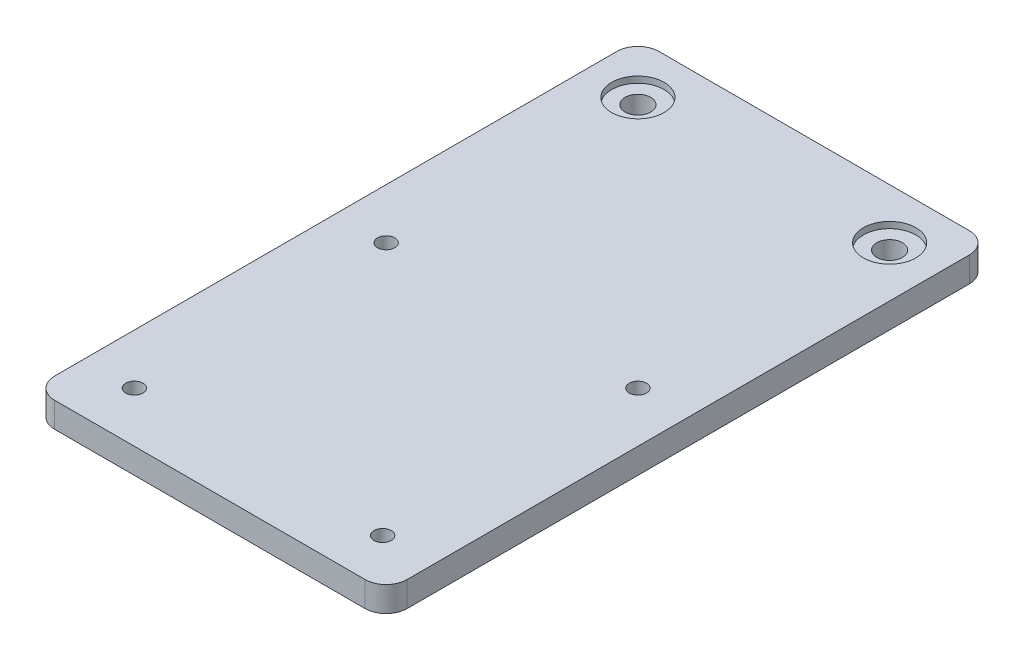
ISO-10303-21;
HEADER;
FILE_DESCRIPTION(('STEP AP214'),'2;1');
FILE_NAME('part.step','',(''),(''),'','','');
FILE_SCHEMA(('AUTOMOTIVE_DESIGN { 1 0 10303 214 1 1 1 1 }'));
ENDSEC;
DATA;
#1=APPLICATION_CONTEXT('core data for automotive mechanical design processes');
#2=APPLICATION_PROTOCOL_DEFINITION('international standard','automotive_design',2000,#1);
#3=PRODUCT_CONTEXT('',#1,'mechanical');
#4=PRODUCT('Part','Part','',(#3));
#5=PRODUCT_RELATED_PRODUCT_CATEGORY('part','',(#4));
#6=PRODUCT_DEFINITION_FORMATION('','',#4);
#7=PRODUCT_DEFINITION_CONTEXT('part definition',#1,'design');
#8=PRODUCT_DEFINITION('design','',#6,#7);
#9=PRODUCT_DEFINITION_SHAPE('','',#8);
#10=(LENGTH_UNIT() NAMED_UNIT(*) SI_UNIT(.MILLI.,.METRE.));
#11=(NAMED_UNIT(*) PLANE_ANGLE_UNIT() SI_UNIT($,.RADIAN.));
#12=(NAMED_UNIT(*) SI_UNIT($,.STERADIAN.) SOLID_ANGLE_UNIT());
#13=UNCERTAINTY_MEASURE_WITH_UNIT(LENGTH_MEASURE(1.E-05),#10,'distance_accuracy_value','');
#14=(GEOMETRIC_REPRESENTATION_CONTEXT(3) GLOBAL_UNCERTAINTY_ASSIGNED_CONTEXT((#13)) GLOBAL_UNIT_ASSIGNED_CONTEXT((#10,
#11,#12)) REPRESENTATION_CONTEXT('',''));
#15=CARTESIAN_POINT('',(0.,0.,0.));
#16=DIRECTION('',(0.,0.,1.));
#17=DIRECTION('',(1.,0.,0.));
#18=AXIS2_PLACEMENT_3D('',#15,#16,#17);
#19=CARTESIAN_POINT('',(30.,6.,-60.));
#20=DIRECTION('',(0.,-1.,0.));
#21=DIRECTION('',(0.,0.,-1.));
#22=AXIS2_PLACEMENT_3D('',#19,#20,#21);
#23=CYLINDRICAL_SURFACE('',#22,3.05);
#24=CARTESIAN_POINT('',(30.,0.,-60.));
#25=DIRECTION('',(0.,-1.,0.));
#26=DIRECTION('',(0.,0.,-1.));
#27=AXIS2_PLACEMENT_3D('',#24,#25,#26);
#28=CIRCLE('',#27,3.05);
#29=CARTESIAN_POINT('',(30.,0.,-63.05));
#30=VERTEX_POINT('',#29);
#31=EDGE_CURVE('E177',#30,#30,#28,.T.);
#32=ORIENTED_EDGE('',*,*,#31,.T.);
#33=EDGE_LOOP('',(#32));
#34=FACE_BOUND('',#33,.T.);
#35=CARTESIAN_POINT('',(30.,4.5,-60.));
#36=DIRECTION('',(0.,1.,0.));
#37=DIRECTION('',(0.,0.,1.));
#38=AXIS2_PLACEMENT_3D('',#35,#36,#37);
#39=CIRCLE('',#38,3.05);
#40=CARTESIAN_POINT('',(30.,4.5,-56.95));
#41=VERTEX_POINT('',#40);
#42=EDGE_CURVE('E43',#41,#41,#39,.F.);
#43=ORIENTED_EDGE('',*,*,#42,.F.);
#44=EDGE_LOOP('',(#43));
#45=FACE_BOUND('',#44,.T.);
#46=ADVANCED_FACE('F39',(#34,#45),#23,.F.);
#47=CARTESIAN_POINT('',(-30.,6.,-60.));
#48=DIRECTION('',(0.,-1.,0.));
#49=DIRECTION('',(0.,0.,-1.));
#50=AXIS2_PLACEMENT_3D('',#47,#48,#49);
#51=CYLINDRICAL_SURFACE('',#50,3.05);
#52=CARTESIAN_POINT('',(-30.,0.,-60.));
#53=DIRECTION('',(0.,-1.,0.));
#54=DIRECTION('',(0.,0.,-1.));
#55=AXIS2_PLACEMENT_3D('',#52,#53,#54);
#56=CIRCLE('',#55,3.05);
#57=CARTESIAN_POINT('',(-30.,0.,-63.05));
#58=VERTEX_POINT('',#57);
#59=EDGE_CURVE('E223',#58,#58,#56,.T.);
#60=ORIENTED_EDGE('',*,*,#59,.T.);
#61=EDGE_LOOP('',(#60));
#62=FACE_BOUND('',#61,.T.);
#63=CARTESIAN_POINT('',(-30.,4.5,-60.));
#64=DIRECTION('',(0.,1.,0.));
#65=DIRECTION('',(0.,0.,1.));
#66=AXIS2_PLACEMENT_3D('',#63,#64,#65);
#67=CIRCLE('',#66,3.05);
#68=CARTESIAN_POINT('',(-30.,4.5,-56.95));
#69=VERTEX_POINT('',#68);
#70=EDGE_CURVE('E178',#69,#69,#67,.F.);
#71=ORIENTED_EDGE('',*,*,#70,.F.);
#72=EDGE_LOOP('',(#71));
#73=FACE_BOUND('',#72,.T.);
#74=ADVANCED_FACE('F272',(#62,#73),#51,.F.);
#75=CARTESIAN_POINT('',(-30.,6.,60.));
#76=DIRECTION('',(0.,-1.,0.));
#77=DIRECTION('',(0.,0.,-1.));
#78=AXIS2_PLACEMENT_3D('',#75,#76,#77);
#79=CYLINDRICAL_SURFACE('',#78,2.05);
#80=CARTESIAN_POINT('',(-30.,6.,60.));
#81=DIRECTION('',(0.,-1.,0.));
#82=DIRECTION('',(0.,0.,-1.));
#83=AXIS2_PLACEMENT_3D('',#80,#81,#82);
#84=CIRCLE('',#83,2.05);
#85=CARTESIAN_POINT('',(-30.,6.,57.95));
#86=VERTEX_POINT('',#85);
#87=EDGE_CURVE('E142',#86,#86,#84,.T.);
#88=ORIENTED_EDGE('',*,*,#87,.F.);
#89=EDGE_LOOP('',(#88));
#90=FACE_BOUND('',#89,.T.);
#91=CARTESIAN_POINT('',(-30.,1.3,60.));
#92=DIRECTION('',(0.,-1.,0.));
#93=DIRECTION('',(0.,0.,-1.));
#94=AXIS2_PLACEMENT_3D('',#91,#92,#93);
#95=CIRCLE('',#94,2.05);
#96=CARTESIAN_POINT('',(-30.,1.3,57.95));
#97=VERTEX_POINT('',#96);
#98=EDGE_CURVE('E175',#97,#97,#95,.F.);
#99=ORIENTED_EDGE('',*,*,#98,.F.);
#100=EDGE_LOOP('',(#99));
#101=FACE_BOUND('',#100,.T.);
#102=ADVANCED_FACE('F279',(#90,#101),#79,.F.);
#103=CARTESIAN_POINT('',(30.,6.,60.8346625899288));
#104=DIRECTION('',(0.,-1.,0.));
#105=DIRECTION('',(0.,0.,-1.));
#106=AXIS2_PLACEMENT_3D('',#103,#104,#105);
#107=CYLINDRICAL_SURFACE('',#106,2.05);
#108=CARTESIAN_POINT('',(30.,6.,60.8346625899288));
#109=DIRECTION('',(0.,-1.,0.));
#110=DIRECTION('',(0.,0.,-1.));
#111=AXIS2_PLACEMENT_3D('',#108,#109,#110);
#112=CIRCLE('',#111,2.05);
#113=CARTESIAN_POINT('',(30.,6.,58.7846625899288));
#114=VERTEX_POINT('',#113);
#115=EDGE_CURVE('E230',#114,#114,#112,.T.);
#116=ORIENTED_EDGE('',*,*,#115,.F.);
#117=EDGE_LOOP('',(#116));
#118=FACE_BOUND('',#117,.T.);
#119=CARTESIAN_POINT('',(30.,1.3,60.8346625899288));
#120=DIRECTION('',(0.,-1.,0.));
#121=DIRECTION('',(0.,0.,-1.));
#122=AXIS2_PLACEMENT_3D('',#119,#120,#121);
#123=CIRCLE('',#122,2.05);
#124=CARTESIAN_POINT('',(30.,1.3,58.7846625899288));
#125=VERTEX_POINT('',#124);
#126=EDGE_CURVE('E172',#125,#125,#123,.F.);
#127=ORIENTED_EDGE('',*,*,#126,.F.);
#128=EDGE_LOOP('',(#127));
#129=FACE_BOUND('',#128,.T.);
#130=ADVANCED_FACE('F292',(#118,#129),#107,.F.);
#131=CARTESIAN_POINT('',(-30.,6.,0.));
#132=DIRECTION('',(0.,-1.,0.));
#133=DIRECTION('',(0.,0.,-1.));
#134=AXIS2_PLACEMENT_3D('',#131,#132,#133);
#135=CYLINDRICAL_SURFACE('',#134,2.05);
#136=CARTESIAN_POINT('',(-30.,6.,0.));
#137=DIRECTION('',(0.,-1.,0.));
#138=DIRECTION('',(0.,0.,-1.));
#139=AXIS2_PLACEMENT_3D('',#136,#137,#138);
#140=CIRCLE('',#139,2.05);
#141=CARTESIAN_POINT('',(-30.,6.,-2.05000000000001));
#142=VERTEX_POINT('',#141);
#143=EDGE_CURVE('E227',#142,#142,#140,.T.);
#144=ORIENTED_EDGE('',*,*,#143,.F.);
#145=EDGE_LOOP('',(#144));
#146=FACE_BOUND('',#145,.T.);
#147=CARTESIAN_POINT('',(-30.,1.3,0.));
#148=DIRECTION('',(0.,-1.,0.));
#149=DIRECTION('',(0.,0.,-1.));
#150=AXIS2_PLACEMENT_3D('',#147,#148,#149);
#151=CIRCLE('',#150,2.05);
#152=CARTESIAN_POINT('',(-30.,1.3,-2.05000000000001));
#153=VERTEX_POINT('',#152);
#154=EDGE_CURVE('E168',#153,#153,#151,.F.);
#155=ORIENTED_EDGE('',*,*,#154,.F.);
#156=EDGE_LOOP('',(#155));
#157=FACE_BOUND('',#156,.T.);
#158=ADVANCED_FACE('F289',(#146,#157),#135,.F.);
#159=CARTESIAN_POINT('',(30.,6.,0.));
#160=DIRECTION('',(0.,-1.,0.));
#161=DIRECTION('',(0.,0.,-1.));
#162=AXIS2_PLACEMENT_3D('',#159,#160,#161);
#163=CYLINDRICAL_SURFACE('',#162,2.05);
#164=CARTESIAN_POINT('',(30.,6.,0.));
#165=DIRECTION('',(0.,-1.,0.));
#166=DIRECTION('',(0.,0.,-1.));
#167=AXIS2_PLACEMENT_3D('',#164,#165,#166);
#168=CIRCLE('',#167,2.05);
#169=CARTESIAN_POINT('',(30.,6.,-2.05000000000001));
#170=VERTEX_POINT('',#169);
#171=EDGE_CURVE('E224',#170,#170,#168,.T.);
#172=ORIENTED_EDGE('',*,*,#171,.F.);
#173=EDGE_LOOP('',(#172));
#174=FACE_BOUND('',#173,.T.);
#175=CARTESIAN_POINT('',(30.,1.3,0.));
#176=DIRECTION('',(0.,-1.,0.));
#177=DIRECTION('',(0.,0.,-1.));
#178=AXIS2_PLACEMENT_3D('',#175,#176,#177);
#179=CIRCLE('',#178,2.05);
#180=CARTESIAN_POINT('',(30.,1.3,-2.05000000000001));
#181=VERTEX_POINT('',#180);
#182=EDGE_CURVE('E165',#181,#181,#179,.F.);
#183=ORIENTED_EDGE('',*,*,#182,.F.);
#184=EDGE_LOOP('',(#183));
#185=FACE_BOUND('',#184,.T.);
#186=ADVANCED_FACE('F287',(#174,#185),#163,.F.);
#187=CARTESIAN_POINT('',(-37.,6.,67.));
#188=DIRECTION('',(0.,-1.,0.));
#189=DIRECTION('',(0.,0.,-1.));
#190=AXIS2_PLACEMENT_3D('',#187,#188,#189);
#191=CYLINDRICAL_SURFACE('',#190,4.99999999999999);
#192=CARTESIAN_POINT('',(-37.,0.,67.));
#193=DIRECTION('',(0.,1.,0.));
#194=DIRECTION('',(0.,0.,-1.));
#195=AXIS2_PLACEMENT_3D('',#192,#193,#194);
#196=CIRCLE('',#195,4.99999999999999);
#197=CARTESIAN_POINT('',(-42.,0.,67.));
#198=VERTEX_POINT('',#197);
#199=CARTESIAN_POINT('',(-37.,0.,72.));
#200=VERTEX_POINT('',#199);
#201=EDGE_CURVE('E138',#198,#200,#196,.T.);
#202=ORIENTED_EDGE('',*,*,#201,.T.);
#203=DIRECTION('',(0.,-1.,0.));
#204=VECTOR('',#203,1.);
#205=CARTESIAN_POINT('',(-37.,6.,72.));
#206=LINE('',#205,#204);
#207=CARTESIAN_POINT('',(-37.,6.,72.));
#208=VERTEX_POINT('',#207);
#209=EDGE_CURVE('E11',#208,#200,#206,.T.);
#210=ORIENTED_EDGE('',*,*,#209,.F.);
#211=CARTESIAN_POINT('',(-37.,6.,67.));
#212=DIRECTION('',(0.,1.,0.));
#213=DIRECTION('',(0.,0.,-1.));
#214=AXIS2_PLACEMENT_3D('',#211,#212,#213);
#215=CIRCLE('',#214,4.99999999999999);
#216=CARTESIAN_POINT('',(-42.,6.,67.));
#217=VERTEX_POINT('',#216);
#218=EDGE_CURVE('E153',#217,#208,#215,.T.);
#219=ORIENTED_EDGE('',*,*,#218,.F.);
#220=DIRECTION('',(0.,-1.,0.));
#221=VECTOR('',#220,1.);
#222=CARTESIAN_POINT('',(-42.,6.,67.));
#223=LINE('',#222,#221);
#224=EDGE_CURVE('E134',#217,#198,#223,.T.);
#225=ORIENTED_EDGE('',*,*,#224,.T.);
#226=EDGE_LOOP('',(#202,#210,#219,#225));
#227=FACE_BOUND('',#226,.T.);
#228=ADVANCED_FACE('F41',(#227),#191,.T.);
#229=CARTESIAN_POINT('',(37.,6.,72.));
#230=DIRECTION('',(0.,0.,-1.));
#231=DIRECTION('',(-1.,0.,0.));
#232=AXIS2_PLACEMENT_3D('',#229,#230,#231);
#233=PLANE('',#232);
#234=DIRECTION('',(1.,0.,0.));
#235=VECTOR('',#234,1.);
#236=CARTESIAN_POINT('',(37.,0.,72.));
#237=LINE('',#236,#235);
#238=CARTESIAN_POINT('',(37.,0.,72.));
#239=VERTEX_POINT('',#238);
#240=EDGE_CURVE('E141',#200,#239,#237,.T.);
#241=ORIENTED_EDGE('',*,*,#240,.T.);
#242=DIRECTION('',(0.,-1.,0.));
#243=VECTOR('',#242,1.);
#244=CARTESIAN_POINT('',(37.,6.,72.));
#245=LINE('',#244,#243);
#246=CARTESIAN_POINT('',(37.,6.,72.));
#247=VERTEX_POINT('',#246);
#248=EDGE_CURVE('E49',#247,#239,#245,.T.);
#249=ORIENTED_EDGE('',*,*,#248,.F.);
#250=DIRECTION('',(1.,0.,0.));
#251=VECTOR('',#250,1.);
#252=CARTESIAN_POINT('',(37.,6.,72.));
#253=LINE('',#252,#251);
#254=EDGE_CURVE('E101',#208,#247,#253,.T.);
#255=ORIENTED_EDGE('',*,*,#254,.F.);
#256=ORIENTED_EDGE('',*,*,#209,.T.);
#257=EDGE_LOOP('',(#241,#249,#255,#256));
#258=FACE_BOUND('',#257,.T.);
#259=ADVANCED_FACE('F531',(#258),#233,.F.);
#260=CARTESIAN_POINT('',(37.,6.,67.));
#261=DIRECTION('',(0.,-1.,0.));
#262=DIRECTION('',(0.,0.,-1.));
#263=AXIS2_PLACEMENT_3D('',#260,#261,#262);
#264=CYLINDRICAL_SURFACE('',#263,5.);
#265=CARTESIAN_POINT('',(37.,0.,67.));
#266=DIRECTION('',(0.,1.,0.));
#267=DIRECTION('',(0.,0.,1.));
#268=AXIS2_PLACEMENT_3D('',#265,#266,#267);
#269=CIRCLE('',#268,5.);
#270=CARTESIAN_POINT('',(42.,0.,67.));
#271=VERTEX_POINT('',#270);
#272=EDGE_CURVE('E144',#239,#271,#269,.T.);
#273=ORIENTED_EDGE('',*,*,#272,.T.);
#274=DIRECTION('',(0.,-1.,0.));
#275=VECTOR('',#274,1.);
#276=CARTESIAN_POINT('',(42.,6.,67.));
#277=LINE('',#276,#275);
#278=CARTESIAN_POINT('',(42.,6.,67.));
#279=VERTEX_POINT('',#278);
#280=EDGE_CURVE('E160',#279,#271,#277,.T.);
#281=ORIENTED_EDGE('',*,*,#280,.F.);
#282=CARTESIAN_POINT('',(37.,6.,67.));
#283=DIRECTION('',(0.,1.,0.));
#284=DIRECTION('',(0.,0.,1.));
#285=AXIS2_PLACEMENT_3D('',#282,#283,#284);
#286=CIRCLE('',#285,5.);
#287=EDGE_CURVE('E239',#247,#279,#286,.T.);
#288=ORIENTED_EDGE('',*,*,#287,.F.);
#289=ORIENTED_EDGE('',*,*,#248,.T.);
#290=EDGE_LOOP('',(#273,#281,#288,#289));
#291=FACE_BOUND('',#290,.T.);
#292=ADVANCED_FACE('F523',(#291),#264,.T.);
#293=CARTESIAN_POINT('',(42.,6.,67.));
#294=DIRECTION('',(-1.,0.,0.));
#295=DIRECTION('',(0.,0.,1.));
#296=AXIS2_PLACEMENT_3D('',#293,#294,#295);
#297=PLANE('',#296);
#298=DIRECTION('',(0.,0.,-1.));
#299=VECTOR('',#298,1.);
#300=CARTESIAN_POINT('',(42.,0.,67.));
#301=LINE('',#300,#299);
#302=CARTESIAN_POINT('',(42.,0.,-67.));
#303=VERTEX_POINT('',#302);
#304=EDGE_CURVE('E146',#271,#303,#301,.T.);
#305=ORIENTED_EDGE('',*,*,#304,.T.);
#306=DIRECTION('',(0.,-1.,0.));
#307=VECTOR('',#306,1.);
#308=CARTESIAN_POINT('',(42.,6.,-67.));
#309=LINE('',#308,#307);
#310=CARTESIAN_POINT('',(42.,6.,-67.));
#311=VERTEX_POINT('',#310);
#312=EDGE_CURVE('E157',#311,#303,#309,.T.);
#313=ORIENTED_EDGE('',*,*,#312,.F.);
#314=DIRECTION('',(0.,0.,-1.));
#315=VECTOR('',#314,1.);
#316=CARTESIAN_POINT('',(42.,6.,67.));
#317=LINE('',#316,#315);
#318=EDGE_CURVE('E241',#279,#311,#317,.T.);
#319=ORIENTED_EDGE('',*,*,#318,.F.);
#320=ORIENTED_EDGE('',*,*,#280,.T.);
#321=EDGE_LOOP('',(#305,#313,#319,#320));
#322=FACE_BOUND('',#321,.T.);
#323=ADVANCED_FACE('F247',(#322),#297,.F.);
#324=CARTESIAN_POINT('',(37.,6.,-67.));
#325=DIRECTION('',(0.,-1.,0.));
#326=DIRECTION('',(0.,0.,-1.));
#327=AXIS2_PLACEMENT_3D('',#324,#325,#326);
#328=CYLINDRICAL_SURFACE('',#327,4.99999999999999);
#329=CARTESIAN_POINT('',(37.,0.,-67.));
#330=DIRECTION('',(0.,1.,0.));
#331=DIRECTION('',(0.,0.,1.));
#332=AXIS2_PLACEMENT_3D('',#329,#330,#331);
#333=CIRCLE('',#332,4.99999999999999);
#334=CARTESIAN_POINT('',(37.,0.,-72.));
#335=VERTEX_POINT('',#334);
#336=EDGE_CURVE('E148',#303,#335,#333,.T.);
#337=ORIENTED_EDGE('',*,*,#336,.T.);
#338=DIRECTION('',(0.,-1.,0.));
#339=VECTOR('',#338,1.);
#340=CARTESIAN_POINT('',(37.,6.,-72.));
#341=LINE('',#340,#339);
#342=CARTESIAN_POINT('',(37.,6.,-72.));
#343=VERTEX_POINT('',#342);
#344=EDGE_CURVE('E129',#343,#335,#341,.T.);
#345=ORIENTED_EDGE('',*,*,#344,.F.);
#346=CARTESIAN_POINT('',(37.,6.,-67.));
#347=DIRECTION('',(0.,1.,0.));
#348=DIRECTION('',(0.,0.,1.));
#349=AXIS2_PLACEMENT_3D('',#346,#347,#348);
#350=CIRCLE('',#349,4.99999999999999);
#351=EDGE_CURVE('E120',#311,#343,#350,.T.);
#352=ORIENTED_EDGE('',*,*,#351,.F.);
#353=ORIENTED_EDGE('',*,*,#312,.T.);
#354=EDGE_LOOP('',(#337,#345,#352,#353));
#355=FACE_BOUND('',#354,.T.);
#356=ADVANCED_FACE('F251',(#355),#328,.T.);
#357=CARTESIAN_POINT('',(37.,6.,-72.));
#358=DIRECTION('',(0.,0.,1.));
#359=DIRECTION('',(1.,0.,0.));
#360=AXIS2_PLACEMENT_3D('',#357,#358,#359);
#361=PLANE('',#360);
#362=DIRECTION('',(-1.,0.,0.));
#363=VECTOR('',#362,1.);
#364=CARTESIAN_POINT('',(37.,0.,-72.));
#365=LINE('',#364,#363);
#366=CARTESIAN_POINT('',(-37.,0.,-72.));
#367=VERTEX_POINT('',#366);
#368=EDGE_CURVE('E128',#335,#367,#365,.T.);
#369=ORIENTED_EDGE('',*,*,#368,.T.);
#370=DIRECTION('',(0.,-1.,0.));
#371=VECTOR('',#370,1.);
#372=CARTESIAN_POINT('',(-37.,6.,-72.));
#373=LINE('',#372,#371);
#374=CARTESIAN_POINT('',(-37.,6.,-72.));
#375=VERTEX_POINT('',#374);
#376=EDGE_CURVE('E125',#375,#367,#373,.T.);
#377=ORIENTED_EDGE('',*,*,#376,.F.);
#378=DIRECTION('',(-1.,0.,0.));
#379=VECTOR('',#378,1.);
#380=CARTESIAN_POINT('',(37.,6.,-72.));
#381=LINE('',#380,#379);
#382=EDGE_CURVE('E114',#343,#375,#381,.T.);
#383=ORIENTED_EDGE('',*,*,#382,.F.);
#384=ORIENTED_EDGE('',*,*,#344,.T.);
#385=EDGE_LOOP('',(#369,#377,#383,#384));
#386=FACE_BOUND('',#385,.T.);
#387=ADVANCED_FACE('F126',(#386),#361,.F.);
#388=CARTESIAN_POINT('',(-37.,6.,-67.));
#389=DIRECTION('',(0.,-1.,0.));
#390=DIRECTION('',(0.,0.,-1.));
#391=AXIS2_PLACEMENT_3D('',#388,#389,#390);
#392=CYLINDRICAL_SURFACE('',#391,5.);
#393=CARTESIAN_POINT('',(-37.,0.,-67.));
#394=DIRECTION('',(0.,1.,0.));
#395=DIRECTION('',(0.,0.,-1.));
#396=AXIS2_PLACEMENT_3D('',#393,#394,#395);
#397=CIRCLE('',#396,5.);
#398=CARTESIAN_POINT('',(-42.,0.,-67.));
#399=VERTEX_POINT('',#398);
#400=EDGE_CURVE('E87',#367,#399,#397,.T.);
#401=ORIENTED_EDGE('',*,*,#400,.T.);
#402=DIRECTION('',(0.,-1.,0.));
#403=VECTOR('',#402,1.);
#404=CARTESIAN_POINT('',(-42.,6.,-67.));
#405=LINE('',#404,#403);
#406=CARTESIAN_POINT('',(-42.,6.,-67.));
#407=VERTEX_POINT('',#406);
#408=EDGE_CURVE('E130',#407,#399,#405,.T.);
#409=ORIENTED_EDGE('',*,*,#408,.F.);
#410=CARTESIAN_POINT('',(-37.,6.,-67.));
#411=DIRECTION('',(0.,1.,0.));
#412=DIRECTION('',(0.,0.,-1.));
#413=AXIS2_PLACEMENT_3D('',#410,#411,#412);
#414=CIRCLE('',#413,5.);
#415=EDGE_CURVE('E118',#375,#407,#414,.T.);
#416=ORIENTED_EDGE('',*,*,#415,.F.);
#417=ORIENTED_EDGE('',*,*,#376,.T.);
#418=EDGE_LOOP('',(#401,#409,#416,#417));
#419=FACE_BOUND('',#418,.T.);
#420=ADVANCED_FACE('F132',(#419),#392,.T.);
#421=CARTESIAN_POINT('',(-42.,6.,67.));
#422=DIRECTION('',(1.,0.,0.));
#423=DIRECTION('',(0.,0.,-1.));
#424=AXIS2_PLACEMENT_3D('',#421,#422,#423);
#425=PLANE('',#424);
#426=DIRECTION('',(0.,0.,1.));
#427=VECTOR('',#426,1.);
#428=CARTESIAN_POINT('',(-42.,0.,67.));
#429=LINE('',#428,#427);
#430=EDGE_CURVE('E93',#399,#198,#429,.T.);
#431=ORIENTED_EDGE('',*,*,#430,.T.);
#432=ORIENTED_EDGE('',*,*,#224,.F.);
#433=DIRECTION('',(0.,0.,1.));
#434=VECTOR('',#433,1.);
#435=CARTESIAN_POINT('',(-42.,6.,67.));
#436=LINE('',#435,#434);
#437=EDGE_CURVE('E58',#407,#217,#436,.T.);
#438=ORIENTED_EDGE('',*,*,#437,.F.);
#439=ORIENTED_EDGE('',*,*,#408,.T.);
#440=EDGE_LOOP('',(#431,#432,#438,#439));
#441=FACE_BOUND('',#440,.T.);
#442=ADVANCED_FACE('F259',(#441),#425,.F.);
#443=CARTESIAN_POINT('',(-37.,6.,67.));
#444=DIRECTION('',(0.,-1.,0.));
#445=DIRECTION('',(0.,0.,-1.));
#446=AXIS2_PLACEMENT_3D('',#443,#444,#445);
#447=PLANE('',#446);
#448=CARTESIAN_POINT('',(-30.,6.,-60.));
#449=DIRECTION('',(0.,1.,0.));
#450=DIRECTION('',(0.,0.,1.));
#451=AXIS2_PLACEMENT_3D('',#448,#449,#450);
#452=CIRCLE('',#451,6.25);
#453=CARTESIAN_POINT('',(-30.,6.,-53.75));
#454=VERTEX_POINT('',#453);
#455=EDGE_CURVE('E186',#454,#454,#452,.T.);
#456=ORIENTED_EDGE('',*,*,#455,.F.);
#457=EDGE_LOOP('',(#456));
#458=FACE_BOUND('',#457,.T.);
#459=CARTESIAN_POINT('',(30.,6.,-60.));
#460=DIRECTION('',(0.,1.,0.));
#461=DIRECTION('',(0.,0.,1.));
#462=AXIS2_PLACEMENT_3D('',#459,#460,#461);
#463=CIRCLE('',#462,6.25);
#464=CARTESIAN_POINT('',(30.,6.,-53.75));
#465=VERTEX_POINT('',#464);
#466=EDGE_CURVE('E191',#465,#465,#463,.T.);
#467=ORIENTED_EDGE('',*,*,#466,.F.);
#468=EDGE_LOOP('',(#467));
#469=FACE_BOUND('',#468,.T.);
#470=ORIENTED_EDGE('',*,*,#171,.T.);
#471=EDGE_LOOP('',(#470));
#472=FACE_BOUND('',#471,.T.);
#473=ORIENTED_EDGE('',*,*,#143,.T.);
#474=EDGE_LOOP('',(#473));
#475=FACE_BOUND('',#474,.T.);
#476=ORIENTED_EDGE('',*,*,#115,.T.);
#477=EDGE_LOOP('',(#476));
#478=FACE_BOUND('',#477,.T.);
#479=ORIENTED_EDGE('',*,*,#87,.T.);
#480=EDGE_LOOP('',(#479));
#481=FACE_BOUND('',#480,.T.);
#482=ORIENTED_EDGE('',*,*,#218,.T.);
#483=ORIENTED_EDGE('',*,*,#254,.T.);
#484=ORIENTED_EDGE('',*,*,#287,.T.);
#485=ORIENTED_EDGE('',*,*,#318,.T.);
#486=ORIENTED_EDGE('',*,*,#351,.T.);
#487=ORIENTED_EDGE('',*,*,#382,.T.);
#488=ORIENTED_EDGE('',*,*,#415,.T.);
#489=ORIENTED_EDGE('',*,*,#437,.T.);
#490=EDGE_LOOP('',(#482,#483,#484,#485,#486,#487,#488,#489));
#491=FACE_BOUND('',#490,.T.);
#492=ADVANCED_FACE('F116',(#458,#469,#472,#475,#478,#481,#491),#447,.F.);
#493=CARTESIAN_POINT('',(-37.,0.,67.));
#494=DIRECTION('',(0.,-1.,0.));
#495=DIRECTION('',(0.,0.,-1.));
#496=AXIS2_PLACEMENT_3D('',#493,#494,#495);
#497=PLANE('',#496);
#498=CARTESIAN_POINT('',(30.,0.,60.8346625899288));
#499=DIRECTION('',(0.,-1.,0.));
#500=DIRECTION('',(0.,0.,-1.));
#501=AXIS2_PLACEMENT_3D('',#498,#499,#500);
#502=CIRCLE('',#501,5.25);
#503=CARTESIAN_POINT('',(30.,0.,55.5846625899288));
#504=VERTEX_POINT('',#503);
#505=EDGE_CURVE('E205',#504,#504,#502,.T.);
#506=ORIENTED_EDGE('',*,*,#505,.F.);
#507=EDGE_LOOP('',(#506));
#508=FACE_BOUND('',#507,.T.);
#509=CARTESIAN_POINT('',(-30.,0.,0.));
#510=DIRECTION('',(0.,-1.,0.));
#511=DIRECTION('',(0.,0.,-1.));
#512=AXIS2_PLACEMENT_3D('',#509,#510,#511);
#513=CIRCLE('',#512,5.25);
#514=CARTESIAN_POINT('',(-30.,0.,-5.25000000000001));
#515=VERTEX_POINT('',#514);
#516=EDGE_CURVE('E212',#515,#515,#513,.T.);
#517=ORIENTED_EDGE('',*,*,#516,.F.);
#518=EDGE_LOOP('',(#517));
#519=FACE_BOUND('',#518,.T.);
#520=CARTESIAN_POINT('',(30.,0.,0.));
#521=DIRECTION('',(0.,-1.,0.));
#522=DIRECTION('',(0.,0.,-1.));
#523=AXIS2_PLACEMENT_3D('',#520,#521,#522);
#524=CIRCLE('',#523,5.25);
#525=CARTESIAN_POINT('',(30.,0.,-5.25000000000001));
#526=VERTEX_POINT('',#525);
#527=EDGE_CURVE('E199',#526,#526,#524,.T.);
#528=ORIENTED_EDGE('',*,*,#527,.F.);
#529=EDGE_LOOP('',(#528));
#530=FACE_BOUND('',#529,.T.);
#531=CARTESIAN_POINT('',(-30.,0.,60.));
#532=DIRECTION('',(0.,-1.,0.));
#533=DIRECTION('',(0.,0.,-1.));
#534=AXIS2_PLACEMENT_3D('',#531,#532,#533);
#535=CIRCLE('',#534,5.25);
#536=CARTESIAN_POINT('',(-30.,0.,54.75));
#537=VERTEX_POINT('',#536);
#538=EDGE_CURVE('E208',#537,#537,#535,.T.);
#539=ORIENTED_EDGE('',*,*,#538,.F.);
#540=EDGE_LOOP('',(#539));
#541=FACE_BOUND('',#540,.T.);
#542=ORIENTED_EDGE('',*,*,#59,.F.);
#543=EDGE_LOOP('',(#542));
#544=FACE_BOUND('',#543,.T.);
#545=ORIENTED_EDGE('',*,*,#31,.F.);
#546=EDGE_LOOP('',(#545));
#547=FACE_BOUND('',#546,.T.);
#548=ORIENTED_EDGE('',*,*,#201,.F.);
#549=ORIENTED_EDGE('',*,*,#430,.F.);
#550=ORIENTED_EDGE('',*,*,#400,.F.);
#551=ORIENTED_EDGE('',*,*,#368,.F.);
#552=ORIENTED_EDGE('',*,*,#336,.F.);
#553=ORIENTED_EDGE('',*,*,#304,.F.);
#554=ORIENTED_EDGE('',*,*,#272,.F.);
#555=ORIENTED_EDGE('',*,*,#240,.F.);
#556=EDGE_LOOP('',(#548,#549,#550,#551,#552,#553,#554,#555));
#557=FACE_BOUND('',#556,.T.);
#558=ADVANCED_FACE('F254',(#508,#519,#530,#541,#544,#547,#557),#497,.T.);
#559=CARTESIAN_POINT('',(30.,1.3,0.));
#560=DIRECTION('',(0.,-1.,0.));
#561=DIRECTION('',(0.,0.,-1.));
#562=AXIS2_PLACEMENT_3D('',#559,#560,#561);
#563=PLANE('',#562);
#564=CARTESIAN_POINT('',(30.,1.3,0.));
#565=DIRECTION('',(0.,-1.,0.));
#566=DIRECTION('',(0.,0.,-1.));
#567=AXIS2_PLACEMENT_3D('',#564,#565,#566);
#568=CIRCLE('',#567,5.25);
#569=CARTESIAN_POINT('',(30.,1.3,-5.25000000000001));
#570=VERTEX_POINT('',#569);
#571=EDGE_CURVE('E184',#570,#570,#568,.T.);
#572=ORIENTED_EDGE('',*,*,#571,.T.);
#573=EDGE_LOOP('',(#572));
#574=FACE_BOUND('',#573,.T.);
#575=ORIENTED_EDGE('',*,*,#182,.T.);
#576=EDGE_LOOP('',(#575));
#577=FACE_BOUND('',#576,.T.);
#578=ADVANCED_FACE('F301',(#574,#577),#563,.T.);
#579=CARTESIAN_POINT('',(30.,1.3,0.));
#580=DIRECTION('',(0.,-1.,0.));
#581=DIRECTION('',(0.,0.,-1.));
#582=AXIS2_PLACEMENT_3D('',#579,#580,#581);
#583=CYLINDRICAL_SURFACE('',#582,5.25);
#584=ORIENTED_EDGE('',*,*,#571,.F.);
#585=EDGE_LOOP('',(#584));
#586=FACE_BOUND('',#585,.T.);
#587=ORIENTED_EDGE('',*,*,#527,.T.);
#588=EDGE_LOOP('',(#587));
#589=FACE_BOUND('',#588,.T.);
#590=ADVANCED_FACE('F306',(#586,#589),#583,.F.);
#591=CARTESIAN_POINT('',(-30.,1.3,0.));
#592=DIRECTION('',(0.,-1.,0.));
#593=DIRECTION('',(0.,0.,-1.));
#594=AXIS2_PLACEMENT_3D('',#591,#592,#593);
#595=PLANE('',#594);
#596=CARTESIAN_POINT('',(-30.,1.3,0.));
#597=DIRECTION('',(0.,-1.,0.));
#598=DIRECTION('',(0.,0.,-1.));
#599=AXIS2_PLACEMENT_3D('',#596,#597,#598);
#600=CIRCLE('',#599,5.25);
#601=CARTESIAN_POINT('',(-30.,1.3,-5.25000000000001));
#602=VERTEX_POINT('',#601);
#603=EDGE_CURVE('E202',#602,#602,#600,.T.);
#604=ORIENTED_EDGE('',*,*,#603,.T.);
#605=EDGE_LOOP('',(#604));
#606=FACE_BOUND('',#605,.T.);
#607=ORIENTED_EDGE('',*,*,#154,.T.);
#608=EDGE_LOOP('',(#607));
#609=FACE_BOUND('',#608,.T.);
#610=ADVANCED_FACE('F344',(#606,#609),#595,.T.);
#611=CARTESIAN_POINT('',(-30.,1.3,0.));
#612=DIRECTION('',(0.,-1.,0.));
#613=DIRECTION('',(0.,0.,-1.));
#614=AXIS2_PLACEMENT_3D('',#611,#612,#613);
#615=CYLINDRICAL_SURFACE('',#614,5.25);
#616=ORIENTED_EDGE('',*,*,#603,.F.);
#617=EDGE_LOOP('',(#616));
#618=FACE_BOUND('',#617,.T.);
#619=ORIENTED_EDGE('',*,*,#516,.T.);
#620=EDGE_LOOP('',(#619));
#621=FACE_BOUND('',#620,.T.);
#622=ADVANCED_FACE('F347',(#618,#621),#615,.F.);
#623=CARTESIAN_POINT('',(30.,1.3,60.8346625899288));
#624=DIRECTION('',(0.,-1.,0.));
#625=DIRECTION('',(0.,0.,-1.));
#626=AXIS2_PLACEMENT_3D('',#623,#624,#625);
#627=PLANE('',#626);
#628=CARTESIAN_POINT('',(30.,1.3,60.8346625899288));
#629=DIRECTION('',(0.,-1.,0.));
#630=DIRECTION('',(0.,0.,-1.));
#631=AXIS2_PLACEMENT_3D('',#628,#629,#630);
#632=CIRCLE('',#631,5.25);
#633=CARTESIAN_POINT('',(30.,1.3,55.5846625899288));
#634=VERTEX_POINT('',#633);
#635=EDGE_CURVE('E209',#634,#634,#632,.T.);
#636=ORIENTED_EDGE('',*,*,#635,.T.);
#637=EDGE_LOOP('',(#636));
#638=FACE_BOUND('',#637,.T.);
#639=ORIENTED_EDGE('',*,*,#126,.T.);
#640=EDGE_LOOP('',(#639));
#641=FACE_BOUND('',#640,.T.);
#642=ADVANCED_FACE('F340',(#638,#641),#627,.T.);
#643=CARTESIAN_POINT('',(30.,1.3,60.8346625899288));
#644=DIRECTION('',(0.,-1.,0.));
#645=DIRECTION('',(0.,0.,-1.));
#646=AXIS2_PLACEMENT_3D('',#643,#644,#645);
#647=CYLINDRICAL_SURFACE('',#646,5.25);
#648=ORIENTED_EDGE('',*,*,#635,.F.);
#649=EDGE_LOOP('',(#648));
#650=FACE_BOUND('',#649,.T.);
#651=ORIENTED_EDGE('',*,*,#505,.T.);
#652=EDGE_LOOP('',(#651));
#653=FACE_BOUND('',#652,.T.);
#654=ADVANCED_FACE('F331',(#650,#653),#647,.F.);
#655=CARTESIAN_POINT('',(-30.,1.3,60.));
#656=DIRECTION('',(0.,-1.,0.));
#657=DIRECTION('',(0.,0.,-1.));
#658=AXIS2_PLACEMENT_3D('',#655,#656,#657);
#659=PLANE('',#658);
#660=CARTESIAN_POINT('',(-30.,1.3,60.));
#661=DIRECTION('',(0.,-1.,0.));
#662=DIRECTION('',(0.,0.,-1.));
#663=AXIS2_PLACEMENT_3D('',#660,#661,#662);
#664=CIRCLE('',#663,5.25);
#665=CARTESIAN_POINT('',(-30.,1.3,54.75));
#666=VERTEX_POINT('',#665);
#667=EDGE_CURVE('E169',#666,#666,#664,.T.);
#668=ORIENTED_EDGE('',*,*,#667,.T.);
#669=EDGE_LOOP('',(#668));
#670=FACE_BOUND('',#669,.T.);
#671=ORIENTED_EDGE('',*,*,#98,.T.);
#672=EDGE_LOOP('',(#671));
#673=FACE_BOUND('',#672,.T.);
#674=ADVANCED_FACE('F323',(#670,#673),#659,.T.);
#675=CARTESIAN_POINT('',(-30.,1.3,60.));
#676=DIRECTION('',(0.,-1.,0.));
#677=DIRECTION('',(0.,0.,-1.));
#678=AXIS2_PLACEMENT_3D('',#675,#676,#677);
#679=CYLINDRICAL_SURFACE('',#678,5.25);
#680=ORIENTED_EDGE('',*,*,#667,.F.);
#681=EDGE_LOOP('',(#680));
#682=FACE_BOUND('',#681,.T.);
#683=ORIENTED_EDGE('',*,*,#538,.T.);
#684=EDGE_LOOP('',(#683));
#685=FACE_BOUND('',#684,.T.);
#686=ADVANCED_FACE('F285',(#682,#685),#679,.F.);
#687=CARTESIAN_POINT('',(-30.,4.5,-60.));
#688=DIRECTION('',(0.,1.,0.));
#689=DIRECTION('',(0.,0.,1.));
#690=AXIS2_PLACEMENT_3D('',#687,#688,#689);
#691=PLANE('',#690);
#692=CARTESIAN_POINT('',(-30.,4.5,-60.));
#693=DIRECTION('',(0.,1.,0.));
#694=DIRECTION('',(0.,0.,1.));
#695=AXIS2_PLACEMENT_3D('',#692,#693,#694);
#696=CIRCLE('',#695,6.25);
#697=CARTESIAN_POINT('',(-30.,4.5,-53.75));
#698=VERTEX_POINT('',#697);
#699=EDGE_CURVE('E180',#698,#698,#696,.T.);
#700=ORIENTED_EDGE('',*,*,#699,.T.);
#701=EDGE_LOOP('',(#700));
#702=FACE_BOUND('',#701,.T.);
#703=ORIENTED_EDGE('',*,*,#70,.T.);
#704=EDGE_LOOP('',(#703));
#705=FACE_BOUND('',#704,.T.);
#706=ADVANCED_FACE('F322',(#702,#705),#691,.T.);
#707=CARTESIAN_POINT('',(-30.,4.5,-60.));
#708=DIRECTION('',(0.,1.,0.));
#709=DIRECTION('',(0.,0.,1.));
#710=AXIS2_PLACEMENT_3D('',#707,#708,#709);
#711=CYLINDRICAL_SURFACE('',#710,6.25);
#712=ORIENTED_EDGE('',*,*,#699,.F.);
#713=EDGE_LOOP('',(#712));
#714=FACE_BOUND('',#713,.T.);
#715=ORIENTED_EDGE('',*,*,#455,.T.);
#716=EDGE_LOOP('',(#715));
#717=FACE_BOUND('',#716,.T.);
#718=ADVANCED_FACE('F329',(#714,#717),#711,.F.);
#719=CARTESIAN_POINT('',(30.,4.5,-60.));
#720=DIRECTION('',(0.,1.,0.));
#721=DIRECTION('',(0.,0.,1.));
#722=AXIS2_PLACEMENT_3D('',#719,#720,#721);
#723=PLANE('',#722);
#724=CARTESIAN_POINT('',(30.,4.5,-60.));
#725=DIRECTION('',(0.,1.,0.));
#726=DIRECTION('',(0.,0.,1.));
#727=AXIS2_PLACEMENT_3D('',#724,#725,#726);
#728=CIRCLE('',#727,6.25);
#729=CARTESIAN_POINT('',(30.,4.5,-53.75));
#730=VERTEX_POINT('',#729);
#731=EDGE_CURVE('E196',#730,#730,#728,.T.);
#732=ORIENTED_EDGE('',*,*,#731,.T.);
#733=EDGE_LOOP('',(#732));
#734=FACE_BOUND('',#733,.T.);
#735=ORIENTED_EDGE('',*,*,#42,.T.);
#736=EDGE_LOOP('',(#735));
#737=FACE_BOUND('',#736,.T.);
#738=ADVANCED_FACE('F358',(#734,#737),#723,.T.);
#739=CARTESIAN_POINT('',(30.,4.5,-60.));
#740=DIRECTION('',(0.,1.,0.));
#741=DIRECTION('',(0.,0.,1.));
#742=AXIS2_PLACEMENT_3D('',#739,#740,#741);
#743=CYLINDRICAL_SURFACE('',#742,6.25);
#744=ORIENTED_EDGE('',*,*,#731,.F.);
#745=EDGE_LOOP('',(#744));
#746=FACE_BOUND('',#745,.T.);
#747=ORIENTED_EDGE('',*,*,#466,.T.);
#748=EDGE_LOOP('',(#747));
#749=FACE_BOUND('',#748,.T.);
#750=ADVANCED_FACE('F361',(#746,#749),#743,.F.);
#751=CLOSED_SHELL('',(#46,#74,#102,#130,#158,#186,#228,#259,#292,#323,#356,#387,#420,#442,#492,
#558,#578,#590,#610,#622,#642,#654,#674,#686,#706,#718,#738,#750));
#752=MANIFOLD_SOLID_BREP('B2',#751);
#753=ADVANCED_BREP_SHAPE_REPRESENTATION('',(#18,#752),#14);
#754=SHAPE_DEFINITION_REPRESENTATION(#9,#753);
ENDSEC;
END-ISO-10303-21;
